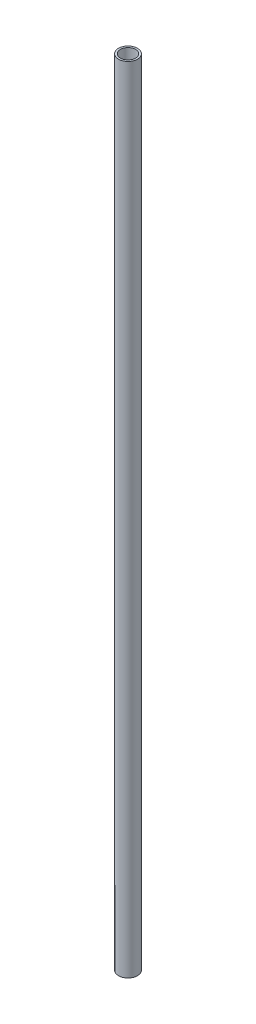
ISO-10303-21;
HEADER;
FILE_DESCRIPTION(('STEP AP214'),'2;1');
FILE_NAME('part.step','',(''),(''),'','','');
FILE_SCHEMA(('AUTOMOTIVE_DESIGN { 1 0 10303 214 1 1 1 1 }'));
ENDSEC;
DATA;
#1=APPLICATION_CONTEXT('core data for automotive mechanical design processes');
#2=APPLICATION_PROTOCOL_DEFINITION('international standard','automotive_design',2000,#1);
#3=PRODUCT_CONTEXT('',#1,'mechanical');
#4=PRODUCT('Part','Part','',(#3));
#5=PRODUCT_RELATED_PRODUCT_CATEGORY('part','',(#4));
#6=PRODUCT_DEFINITION_FORMATION('','',#4);
#7=PRODUCT_DEFINITION_CONTEXT('part definition',#1,'design');
#8=PRODUCT_DEFINITION('design','',#6,#7);
#9=PRODUCT_DEFINITION_SHAPE('','',#8);
#10=(LENGTH_UNIT() NAMED_UNIT(*) SI_UNIT(.MILLI.,.METRE.));
#11=(NAMED_UNIT(*) PLANE_ANGLE_UNIT() SI_UNIT($,.RADIAN.));
#12=(NAMED_UNIT(*) SI_UNIT($,.STERADIAN.) SOLID_ANGLE_UNIT());
#13=UNCERTAINTY_MEASURE_WITH_UNIT(LENGTH_MEASURE(1.E-05),#10,'distance_accuracy_value','');
#14=(GEOMETRIC_REPRESENTATION_CONTEXT(3) GLOBAL_UNCERTAINTY_ASSIGNED_CONTEXT((#13)) GLOBAL_UNIT_ASSIGNED_CONTEXT((#10,
#11,#12)) REPRESENTATION_CONTEXT('',''));
#15=CARTESIAN_POINT('',(0.,0.,0.));
#16=DIRECTION('',(0.,0.,1.));
#17=DIRECTION('',(1.,0.,0.));
#18=AXIS2_PLACEMENT_3D('',#15,#16,#17);
#19=CARTESIAN_POINT('',(0.,0.,0.));
#20=DIRECTION('',(0.,1.,0.));
#21=DIRECTION('',(0.,0.,1.));
#22=AXIS2_PLACEMENT_3D('',#19,#20,#21);
#23=CYLINDRICAL_SURFACE('',#22,13.335);
#24=CARTESIAN_POINT('',(0.,1397.,0.));
#25=DIRECTION('',(0.,1.,0.));
#26=DIRECTION('',(0.,0.,1.));
#27=AXIS2_PLACEMENT_3D('',#24,#25,#26);
#28=CIRCLE('',#27,13.335);
#29=CARTESIAN_POINT('',(0.,1397.,13.335));
#30=VERTEX_POINT('',#29);
#31=EDGE_CURVE('E18',#30,#30,#28,.F.);
#32=ORIENTED_EDGE('',*,*,#31,.F.);
#33=EDGE_LOOP('',(#32));
#34=FACE_BOUND('',#33,.T.);
#35=CARTESIAN_POINT('',(0.,0.,0.));
#36=DIRECTION('',(0.,1.,0.));
#37=DIRECTION('',(0.,0.,1.));
#38=AXIS2_PLACEMENT_3D('',#35,#36,#37);
#39=CIRCLE('',#38,13.335);
#40=CARTESIAN_POINT('',(0.,0.,13.335));
#41=VERTEX_POINT('',#40);
#42=EDGE_CURVE('E27',#41,#41,#39,.F.);
#43=ORIENTED_EDGE('',*,*,#42,.T.);
#44=EDGE_LOOP('',(#43));
#45=FACE_BOUND('',#44,.T.);
#46=ADVANCED_FACE('F15',(#34,#45),#23,.F.);
#47=CARTESIAN_POINT('',(0.,1397.,0.));
#48=DIRECTION('',(0.,1.,0.));
#49=DIRECTION('',(0.,0.,1.));
#50=AXIS2_PLACEMENT_3D('',#47,#48,#49);
#51=PLANE('',#50);
#52=ORIENTED_EDGE('',*,*,#31,.T.);
#53=EDGE_LOOP('',(#52));
#54=FACE_BOUND('',#53,.T.);
#55=CARTESIAN_POINT('',(0.,1397.,0.));
#56=DIRECTION('',(0.,1.,0.));
#57=DIRECTION('',(0.,0.,1.));
#58=AXIS2_PLACEMENT_3D('',#55,#56,#57);
#59=CIRCLE('',#58,16.7005);
#60=CARTESIAN_POINT('',(0.,1397.,16.7005));
#61=VERTEX_POINT('',#60);
#62=EDGE_CURVE('E22',#61,#61,#59,.F.);
#63=ORIENTED_EDGE('',*,*,#62,.F.);
#64=EDGE_LOOP('',(#63));
#65=FACE_BOUND('',#64,.T.);
#66=ADVANCED_FACE('F35',(#54,#65),#51,.T.);
#67=CARTESIAN_POINT('',(0.,0.,0.));
#68=DIRECTION('',(0.,1.,0.));
#69=DIRECTION('',(0.,0.,1.));
#70=AXIS2_PLACEMENT_3D('',#67,#68,#69);
#71=PLANE('',#70);
#72=ORIENTED_EDGE('',*,*,#42,.F.);
#73=EDGE_LOOP('',(#72));
#74=FACE_BOUND('',#73,.T.);
#75=CARTESIAN_POINT('',(0.,0.,0.));
#76=DIRECTION('',(0.,1.,0.));
#77=DIRECTION('',(0.,0.,1.));
#78=AXIS2_PLACEMENT_3D('',#75,#76,#77);
#79=CIRCLE('',#78,16.7005);
#80=CARTESIAN_POINT('',(0.,0.,16.7005));
#81=VERTEX_POINT('',#80);
#82=EDGE_CURVE('E10',#81,#81,#79,.T.);
#83=ORIENTED_EDGE('',*,*,#82,.F.);
#84=EDGE_LOOP('',(#83));
#85=FACE_BOUND('',#84,.T.);
#86=ADVANCED_FACE('F43',(#74,#85),#71,.F.);
#87=CARTESIAN_POINT('',(0.,0.,0.));
#88=DIRECTION('',(0.,1.,0.));
#89=DIRECTION('',(0.,0.,1.));
#90=AXIS2_PLACEMENT_3D('',#87,#88,#89);
#91=CYLINDRICAL_SURFACE('',#90,16.7005);
#92=ORIENTED_EDGE('',*,*,#62,.T.);
#93=EDGE_LOOP('',(#92));
#94=FACE_BOUND('',#93,.T.);
#95=ORIENTED_EDGE('',*,*,#82,.T.);
#96=EDGE_LOOP('',(#95));
#97=FACE_BOUND('',#96,.T.);
#98=ADVANCED_FACE('F44',(#94,#97),#91,.T.);
#99=CLOSED_SHELL('',(#46,#66,#86,#98));
#100=MANIFOLD_SOLID_BREP('B1',#99);
#101=ADVANCED_BREP_SHAPE_REPRESENTATION('',(#18,#100),#14);
#102=SHAPE_DEFINITION_REPRESENTATION(#9,#101);
ENDSEC;
END-ISO-10303-21;
